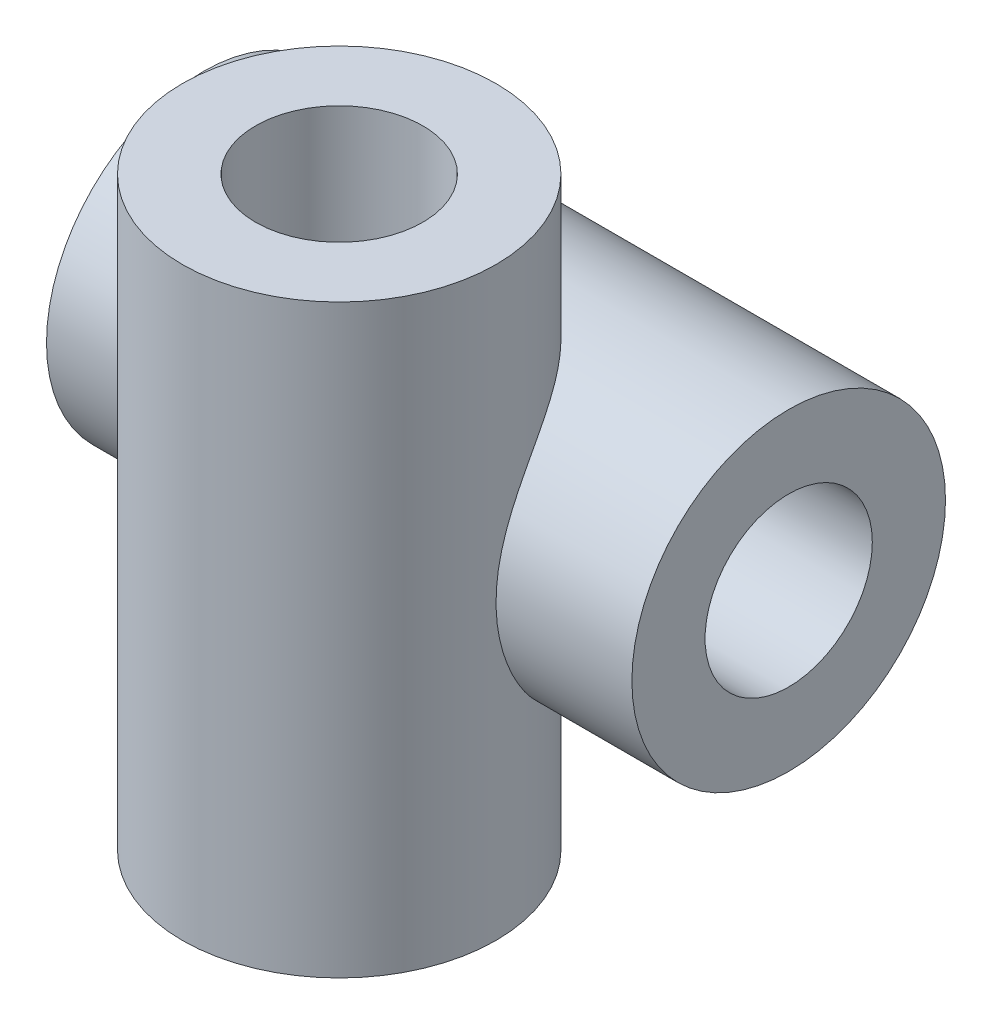
ISO-10303-21;
HEADER;
FILE_DESCRIPTION(('STEP AP214'),'2;1');
FILE_NAME('part.step','',(''),(''),'','','');
FILE_SCHEMA(('AUTOMOTIVE_DESIGN { 1 0 10303 214 1 1 1 1 }'));
ENDSEC;
DATA;
#1=APPLICATION_CONTEXT('core data for automotive mechanical design processes');
#2=APPLICATION_PROTOCOL_DEFINITION('international standard','automotive_design',2000,#1);
#3=PRODUCT_CONTEXT('',#1,'mechanical');
#4=PRODUCT('Part','Part','',(#3));
#5=PRODUCT_RELATED_PRODUCT_CATEGORY('part','',(#4));
#6=PRODUCT_DEFINITION_FORMATION('','',#4);
#7=PRODUCT_DEFINITION_CONTEXT('part definition',#1,'design');
#8=PRODUCT_DEFINITION('design','',#6,#7);
#9=PRODUCT_DEFINITION_SHAPE('','',#8);
#10=(LENGTH_UNIT() NAMED_UNIT(*) SI_UNIT(.MILLI.,.METRE.));
#11=(NAMED_UNIT(*) PLANE_ANGLE_UNIT() SI_UNIT($,.RADIAN.));
#12=(NAMED_UNIT(*) SI_UNIT($,.STERADIAN.) SOLID_ANGLE_UNIT());
#13=UNCERTAINTY_MEASURE_WITH_UNIT(LENGTH_MEASURE(1.E-05),#10,'distance_accuracy_value','');
#14=(GEOMETRIC_REPRESENTATION_CONTEXT(3) GLOBAL_UNCERTAINTY_ASSIGNED_CONTEXT((#13)) GLOBAL_UNIT_ASSIGNED_CONTEXT((#10,
#11,#12)) REPRESENTATION_CONTEXT('',''));
#15=CARTESIAN_POINT('',(0.,0.,0.));
#16=DIRECTION('',(0.,0.,1.));
#17=DIRECTION('',(1.,0.,0.));
#18=AXIS2_PLACEMENT_3D('',#15,#16,#17);
#19=CARTESIAN_POINT('',(0.,28.,0.));
#20=DIRECTION('',(0.,-1.,0.));
#21=DIRECTION('',(0.,0.,-1.));
#22=AXIS2_PLACEMENT_3D('',#19,#20,#21);
#23=CYLINDRICAL_SURFACE('',#22,15.);
#24=CARTESIAN_POINT('',(0.,-28.,0.));
#25=DIRECTION('',(0.,1.,0.));
#26=DIRECTION('',(0.,0.,1.));
#27=AXIS2_PLACEMENT_3D('',#24,#25,#26);
#28=CIRCLE('',#27,15.);
#29=CARTESIAN_POINT('',(0.,-28.,15.));
#30=VERTEX_POINT('',#29);
#31=EDGE_CURVE('E48',#30,#30,#28,.T.);
#32=ORIENTED_EDGE('',*,*,#31,.T.);
#33=EDGE_LOOP('',(#32));
#34=FACE_BOUND('',#33,.T.);
#35=CARTESIAN_POINT('',(0.,28.,0.));
#36=DIRECTION('',(0.,1.,0.));
#37=DIRECTION('',(0.,0.,1.));
#38=AXIS2_PLACEMENT_3D('',#35,#36,#37);
#39=CIRCLE('',#38,15.);
#40=CARTESIAN_POINT('',(0.,28.,15.));
#41=VERTEX_POINT('',#40);
#42=EDGE_CURVE('E43',#41,#41,#39,.T.);
#43=ORIENTED_EDGE('',*,*,#42,.F.);
#44=EDGE_LOOP('',(#43));
#45=FACE_BOUND('',#44,.T.);
#46=CARTESIAN_POINT('',(0.,15.,-15.));
#47=CARTESIAN_POINT('',(0.417709971837821,15.0000025275847,-14.999998325751));
#48=CARTESIAN_POINT('',(0.835456398856134,15.000031163326,-14.9825394653861));
#49=CARTESIAN_POINT('',(1.66806847536857,14.9997863331421,-14.912817418484));
#50=CARTESIAN_POINT('',(2.08293375279841,14.9995128289033,-14.8605498182809));
#51=CARTESIAN_POINT('',(2.9071670976013,14.9975759450424,-14.7215206566269));
#52=CARTESIAN_POINT('',(3.31653081524678,14.995911524653,-14.6347332908982));
#53=CARTESIAN_POINT('',(4.12654826909647,14.9894212157906,-14.4272792640556));
#54=CARTESIAN_POINT('',(4.52720223666966,14.9845954114039,-14.3066135040875));
#55=CARTESIAN_POINT('',(5.31746433504863,14.9693712510489,-14.0320974821879));
#56=CARTESIAN_POINT('',(5.70705741719865,14.9589656534166,-13.8782042517988));
#57=CARTESIAN_POINT('',(6.47177346518002,14.9296044255093,-13.5385074098473));
#58=CARTESIAN_POINT('',(6.84689610555341,14.9106486030507,-13.3527030810771));
#59=CARTESIAN_POINT('',(7.57964083484212,14.8607473501906,-12.9508144009089));
#60=CARTESIAN_POINT('',(7.93726695994425,14.8298046998012,-12.7347370779037));
#61=CARTESIAN_POINT('',(8.63209970901041,14.752134348305,-12.2743830224947));
#62=CARTESIAN_POINT('',(8.96930763389434,14.7054076541094,-12.0301080895543));
#63=CARTESIAN_POINT('',(9.60754858917371,14.5944084508421,-11.526221769803));
#64=CARTESIAN_POINT('',(9.90948071971079,14.53089382746,-11.2675841512964));
#65=CARTESIAN_POINT('',(10.4890939827049,14.3821301649425,-10.7301009567378));
#66=CARTESIAN_POINT('',(10.7667756748621,14.296881627604,-10.4512558473468));
#67=CARTESIAN_POINT('',(11.2951331244478,14.1015977919966,-9.87784104446114));
#68=CARTESIAN_POINT('',(11.5458455005311,13.9915967466957,-9.58329350605121));
#69=CARTESIAN_POINT('',(12.0187585400411,13.7441509370842,-8.98305875935943));
#70=CARTESIAN_POINT('',(12.2409641591352,13.6067109534576,-8.67737349917589));
#71=CARTESIAN_POINT('',(12.6274524871771,13.32339514769,-8.10250681122105));
#72=CARTESIAN_POINT('',(12.7955022804778,13.1812179294094,-7.83402422940655));
#73=CARTESIAN_POINT('',(13.1093115476913,12.8746146557727,-7.2967596411248));
#74=CARTESIAN_POINT('',(13.2550732812539,12.7101908590508,-7.02797766779786));
#75=CARTESIAN_POINT('',(13.5247243837763,12.3591733436415,-6.49394664135596));
#76=CARTESIAN_POINT('',(13.6486130091144,12.1725788715766,-6.22869770863737));
#77=CARTESIAN_POINT('',(13.8755078804518,11.7778553050838,-5.7054034000242));
#78=CARTESIAN_POINT('',(13.9785140050657,11.5697260854898,-5.44735806601005));
#79=CARTESIAN_POINT('',(14.1597157231284,11.145722501777,-4.95650028253699));
#80=CARTESIAN_POINT('',(14.2390049253452,10.9310002596004,-4.72309279834237));
#81=CARTESIAN_POINT('',(14.38195483643,10.4846003768036,-4.26805075057421));
#82=CARTESIAN_POINT('',(14.4456163765809,10.2529236388959,-4.04641556128824));
#83=CARTESIAN_POINT('',(14.5590981018285,9.77388127150179,-3.61690865445537));
#84=CARTESIAN_POINT('',(14.6089152039786,9.52651216260151,-3.40904001034665));
#85=CARTESIAN_POINT('',(14.6965685730541,9.01753128087283,-3.00879612011618));
#86=CARTESIAN_POINT('',(14.7344040189845,8.75591853349502,-2.81642193636331));
#87=CARTESIAN_POINT('',(14.8032316846784,8.19335340251167,-2.43033154847234));
#88=CARTESIAN_POINT('',(14.8331760304423,7.89107008738816,-2.23836683990684));
#89=CARTESIAN_POINT('',(14.883315572908,7.27294273934861,-1.87625669009447));
#90=CARTESIAN_POINT('',(14.9035102855258,6.95709803393673,-1.70611233256895));
#91=CARTESIAN_POINT('',(14.9364316770878,6.31357938932393,-1.38870004960014));
#92=CARTESIAN_POINT('',(14.9491551116875,5.98590037663112,-1.24144208277414));
#93=CARTESIAN_POINT('',(14.9691691593594,5.32067839439317,-0.970767855815314));
#94=CARTESIAN_POINT('',(14.976459496579,4.98313492490781,-0.847352806485482));
#95=CARTESIAN_POINT('',(14.9880693561707,4.25724558313709,-0.611144411772942));
#96=CARTESIAN_POINT('',(14.99190311799,3.86782701361573,-0.501611442069811));
#97=CARTESIAN_POINT('',(14.9969984270507,3.08138685892911,-0.314344517435135));
#98=CARTESIAN_POINT('',(14.9982597849855,2.6843647163767,-0.236612903144592));
#99=CARTESIAN_POINT('',(14.9996976549095,1.88528380098696,-0.113457713665762));
#100=CARTESIAN_POINT('',(14.9998740288551,1.48322439377409,-0.0680382502342384));
#101=CARTESIAN_POINT('',(15.0000249359791,0.676754199452415,-0.00982124349725945));
#102=CARTESIAN_POINT('',(14.9999994683809,0.27234340330326,0.00297617430338129));
#103=CARTESIAN_POINT('',(15.0000005307192,-0.552942244332754,-0.00428381568195574));
#104=CARTESIAN_POINT('',(15.0000292568406,-0.973805615224164,-0.0257232450051484));
#105=CARTESIAN_POINT('',(14.9996905962732,-1.81224941833119,-0.103925278140252));
#106=CARTESIAN_POINT('',(14.9993231943443,-2.22982972361712,-0.160689240932772));
#107=CARTESIAN_POINT('',(14.9969971798298,-3.05888979921935,-0.309166061988291));
#108=CARTESIAN_POINT('',(14.9950379735013,-3.47036723484069,-0.400891954268476));
#109=CARTESIAN_POINT('',(14.9876331754656,-4.28411894959553,-0.618632825069207));
#110=CARTESIAN_POINT('',(14.982187601157,-4.68639327464662,-0.74464763246966));
#111=CARTESIAN_POINT('',(14.9652665429499,-5.47919975751459,-1.03017356463985));
#112=CARTESIAN_POINT('',(14.9537851937244,-5.86972010232427,-1.18971718069707));
#113=CARTESIAN_POINT('',(14.9216787965115,-6.63566143072044,-1.54096979692591));
#114=CARTESIAN_POINT('',(14.9010535709823,-7.01108212097061,-1.7326794216028));
#115=CARTESIAN_POINT('',(14.8470853067959,-7.74371646630495,-2.14652582197755));
#116=CARTESIAN_POINT('',(14.8137454145061,-8.10093460101616,-2.36865506133861));
#117=CARTESIAN_POINT('',(14.7304290712197,-8.79417525322152,-2.84111978796304));
#118=CARTESIAN_POINT('',(14.6804539153127,-9.13019941828836,-3.09145307847951));
#119=CARTESIAN_POINT('',(14.5628071250424,-9.76181446763479,-3.60420732929144));
#120=CARTESIAN_POINT('',(14.4961423064136,-10.0585860628554,-3.86540288898498));
#121=CARTESIAN_POINT('',(14.3407053418227,-10.6276628835971,-4.40721566435319));
#122=CARTESIAN_POINT('',(14.2519339136703,-10.8999689031335,-4.68783224920658));
#123=CARTESIAN_POINT('',(14.0493520370309,-11.417455725919,-5.26391201064581));
#124=CARTESIAN_POINT('',(13.9355763438465,-11.6626734771806,-5.55935414451208));
#125=CARTESIAN_POINT('',(13.680475150859,-12.124597680121,-6.16044533907027));
#126=CARTESIAN_POINT('',(13.5391543095529,-12.3413089425155,-6.46609266660368));
#127=CARTESIAN_POINT('',(13.2488758966405,-12.7174277513136,-7.03959780075856));
#128=CARTESIAN_POINT('',(13.1036417555113,-12.8806172855798,-7.30687149643044));
#129=CARTESIAN_POINT('',(12.7911537375353,-13.1849884825537,-7.84105134416567));
#130=CARTESIAN_POINT('',(12.6239021354562,-13.3261724155173,-8.10795753132409));
#131=CARTESIAN_POINT('',(12.267544746936,-13.5870488047741,-8.63766494449648));
#132=CARTESIAN_POINT('',(12.078437271943,-13.7067395987131,-8.9004658515598));
#133=CARTESIAN_POINT('',(11.6790781220965,-13.9256844769775,-9.41838952491073));
#134=CARTESIAN_POINT('',(11.4688262004683,-14.024938322744,-9.67351220154133));
#135=CARTESIAN_POINT('',(11.0396243426252,-14.1999371914326,-10.1600437712008));
#136=CARTESIAN_POINT('',(10.8216742203904,-14.276627138358,-10.3919977540913));
#137=CARTESIAN_POINT('',(10.3689813370875,-14.414617611834,-10.8437296185302));
#138=CARTESIAN_POINT('',(10.1342393897364,-14.475918883458,-11.0635080891787));
#139=CARTESIAN_POINT('',(9.64925307394955,-14.5849506723218,-11.4889513321215));
#140=CARTESIAN_POINT('',(9.3990052306523,-14.6326781341862,-11.694612918907));
#141=CARTESIAN_POINT('',(8.88446890299318,-14.7164399177867,-12.0901421483108));
#142=CARTESIAN_POINT('',(8.62017945605568,-14.7524734366765,-12.2800087058581));
#143=CARTESIAN_POINT('',(8.05102826782537,-14.8179616742382,-12.6613618089926));
#144=CARTESIAN_POINT('',(7.74479636819553,-14.8463515380935,-12.8509876291343));
#145=CARTESIAN_POINT('',(7.11892934690682,-14.8936592770593,-13.2079773900183));
#146=CARTESIAN_POINT('',(6.7992935241429,-14.912576656031,-13.3753401643555));
#147=CARTESIAN_POINT('',(6.14837455164384,-14.9432236604979,-13.6867715681367));
#148=CARTESIAN_POINT('',(5.81708641824675,-14.9549501699605,-13.8308300792237));
#149=CARTESIAN_POINT('',(5.14485615907067,-14.9732408542989,-14.094710469419));
#150=CARTESIAN_POINT('',(4.8039135592245,-14.979804775217,-14.2145311560068));
#151=CARTESIAN_POINT('',(4.07183297818376,-14.990121961217,-14.4424590150756));
#152=CARTESIAN_POINT('',(3.67967383188683,-14.9934309013979,-14.54731909127));
#153=CARTESIAN_POINT('',(2.88812178634528,-14.997740566843,-14.7249213546017));
#154=CARTESIAN_POINT('',(2.48872836211208,-14.998741123907,-14.7976612009872));
#155=CARTESIAN_POINT('',(1.685308229022,-14.9998397663108,-14.9105433650262));
#156=CARTESIAN_POINT('',(1.28128097591122,-14.999937744531,-14.9506818129724));
#157=CARTESIAN_POINT('',(0.471306250593105,-15.000018502555,-14.9980817343519));
#158=CARTESIAN_POINT('',(0.06535877368235,-15.0000012820766,-15.0053431272139));
#159=CARTESIAN_POINT('',(-0.76126669644604,-14.9999976573918,-14.9865882940012));
#160=CARTESIAN_POINT('',(-1.18191624499946,-15.0000124530755,-14.9592928154225));
#161=CARTESIAN_POINT('',(-2.01943867877046,-14.9994984798848,-14.8694068989933));
#162=CARTESIAN_POINT('',(-2.43631142428532,-14.9989696909855,-14.8068151609178));
#163=CARTESIAN_POINT('',(-3.26347110832669,-14.9960533722076,-14.646749633596));
#164=CARTESIAN_POINT('',(-3.67375541787015,-14.993665118277,-14.5492622644269));
#165=CARTESIAN_POINT('',(-4.4846293851358,-14.9850220601042,-14.3201117746154));
#166=CARTESIAN_POINT('',(-4.88521909368037,-14.9787672761363,-14.1884488331755));
#167=CARTESIAN_POINT('',(-5.67392362890758,-14.9597503529937,-13.8918735471291));
#168=CARTESIAN_POINT('',(-6.06203370898498,-14.9469857682351,-13.7269487208767));
#169=CARTESIAN_POINT('',(-6.82266970930115,-14.9117548235055,-13.3651980715453));
#170=CARTESIAN_POINT('',(-7.19519532825068,-14.8892882760648,-13.1683716320813));
#171=CARTESIAN_POINT('',(-7.92151852307116,-14.8310187684496,-12.7446552542559));
#172=CARTESIAN_POINT('',(-8.27532216941276,-14.7952201617418,-12.5177751452209));
#173=CARTESIAN_POINT('',(-8.96123733623553,-14.7063314905135,-12.0362676261595));
#174=CARTESIAN_POINT('',(-9.29335069808289,-14.6532428960989,-11.7816425764107));
#175=CARTESIAN_POINT('',(-9.91548657821462,-14.5291631531157,-11.2622520360475));
#176=CARTESIAN_POINT('',(-10.2068146694757,-14.4592978076699,-10.9987834035281));
#177=CARTESIAN_POINT('',(-10.764835826514,-14.2971331635782,-10.4532532242111));
#178=CARTESIAN_POINT('',(-11.0315297960786,-14.2048346884203,-10.1711923601845));
#179=CARTESIAN_POINT('',(-11.53773982334,-13.9950006354704,-9.59312065889746));
#180=CARTESIAN_POINT('',(-11.7772919798532,-13.8774991945389,-9.29712910960479));
#181=CARTESIAN_POINT('',(-12.2279460980616,-13.6149048832945,-8.69588466944503));
#182=CARTESIAN_POINT('',(-12.4390527119342,-13.4698165341135,-8.39063330302027));
#183=CARTESIAN_POINT('',(-12.8048141383633,-13.1727416719668,-7.81892216972819));
#184=CARTESIAN_POINT('',(-12.963238738573,-13.0244764549391,-7.55292846006171));
#185=CARTESIAN_POINT('',(-13.2583693053292,-12.7061633741991,-7.02195650004423));
#186=CARTESIAN_POINT('',(-13.395077533706,-12.53611778232,-6.75697814674968));
#187=CARTESIAN_POINT('',(-13.647384342418,-12.1744926574608,-6.23168058642494));
#188=CARTESIAN_POINT('',(-13.7629805973752,-11.9829107561142,-5.97136189547806));
#189=CARTESIAN_POINT('',(-13.9741803664326,-11.5789912462284,-5.45885689865767));
#190=CARTESIAN_POINT('',(-14.0697835384791,-11.366653282673,-5.20667073198275));
#191=CARTESIAN_POINT('',(-14.2387402637397,-10.9322528291606,-4.72447279379023));
#192=CARTESIAN_POINT('',(-14.3128925852103,-10.7110393607413,-4.49397361908411));
#193=CARTESIAN_POINT('',(-14.4460447978536,-10.2519779947188,-4.04555333499994));
#194=CARTESIAN_POINT('',(-14.5050453482254,-10.0141308213613,-3.82763167873924));
#195=CARTESIAN_POINT('',(-14.6097433955921,-9.52311458713808,-3.40625223049219));
#196=CARTESIAN_POINT('',(-14.6554378288615,-9.2699420137909,-3.20279777770832));
#197=CARTESIAN_POINT('',(-14.7354174888615,-8.74975282234133,-2.81198598361791));
#198=CARTESIAN_POINT('',(-14.7697019320976,-8.48273525499358,-2.62462974838928));
#199=CARTESIAN_POINT('',(-14.8319351648085,-7.90693691988514,-2.24809675755569));
#200=CARTESIAN_POINT('',(-14.8588071811872,-7.5967517488417,-2.06088800259792));
#201=CARTESIAN_POINT('',(-14.9033603454453,-6.96314070546059,-1.70917620406524));
#202=CARTESIAN_POINT('',(-14.9210409882503,-6.63971410654734,-1.54467440862369));
#203=CARTESIAN_POINT('',(-14.9494965763765,-5.98140178046816,-1.2393847884451));
#204=CARTESIAN_POINT('',(-14.9602685491387,-5.64651118593719,-1.09860719058021));
#205=CARTESIAN_POINT('',(-14.9769200974444,-4.96729250555149,-0.841685555053715));
#206=CARTESIAN_POINT('',(-14.9827994404127,-4.62296397186009,-0.725542688619921));
#207=CARTESIAN_POINT('',(-14.9919111192904,-3.88481564649686,-0.506078994838479));
#208=CARTESIAN_POINT('',(-14.9947396279387,-3.49002772404388,-0.405984559761038));
#209=CARTESIAN_POINT('',(-14.9983429355167,-2.69359749884994,-0.238219094262302));
#210=CARTESIAN_POINT('',(-14.9991175865037,-2.29195470443869,-0.170550399806542));
#211=CARTESIAN_POINT('',(-14.999933279163,-1.48444774163236,-0.0680856434553241));
#212=CARTESIAN_POINT('',(-14.9999742387192,-1.07858310580705,-0.0332932615528909));
#213=CARTESIAN_POINT('',(-15.0000106423255,-0.265372678028724,0.00317452343168053));
#214=CARTESIAN_POINT('',(-15.0000060863221,0.141973115665028,0.0048498875803842));
#215=CARTESIAN_POINT('',(-14.9999868633883,0.969694980233527,-0.0254503617372257));
#216=CARTESIAN_POINT('',(-14.9999718483227,1.39002837480144,-0.0586052388162819));
#217=CARTESIAN_POINT('',(-14.9992304210627,2.22642477339109,-0.160171370806028));
#218=CARTESIAN_POINT('',(-14.9985039837933,2.64248762636941,-0.228583868379678));
#219=CARTESIAN_POINT('',(-14.994905520696,3.46754211889929,-0.400213627508895));
#220=CARTESIAN_POINT('',(-14.9920326268273,3.87653082913923,-0.503444960757911));
#221=CARTESIAN_POINT('',(-14.9820225517436,4.68432250403006,-0.743958805023065));
#222=CARTESIAN_POINT('',(-14.9748853944318,5.0831255257637,-0.881241125164065));
#223=CARTESIAN_POINT('',(-14.9536126384601,5.86751479982603,-1.18878435862917));
#224=CARTESIAN_POINT('',(-14.9394787957718,6.25310434241862,-1.35903699080654));
#225=CARTESIAN_POINT('',(-14.9009412562617,7.00821614668934,-1.73116221311833));
#226=CARTESIAN_POINT('',(-14.8765373625117,7.37773810012169,-1.93303540953014));
#227=CARTESIAN_POINT('',(-14.8137698026862,8.09753449706135,-2.36645996334791));
#228=CARTESIAN_POINT('',(-14.7754118449636,8.44781674383586,-2.59799915987989));
#229=CARTESIAN_POINT('',(-14.6807510116949,9.12619725945571,-3.08834147291993));
#230=CARTESIAN_POINT('',(-14.6244497948878,9.45429757548092,-3.34714206780705));
#231=CARTESIAN_POINT('',(-14.4937919223737,10.0667624654539,-3.87284899376697));
#232=CARTESIAN_POINT('',(-14.4206869208243,10.3525633281887,-4.13839119791312));
#233=CARTESIAN_POINT('',(-14.2517478013455,10.8993880329059,-4.68722419827999));
#234=CARTESIAN_POINT('',(-14.1559146133894,11.160412888041,-4.97051426795923));
#235=CARTESIAN_POINT('',(-13.9388491803313,11.6552668258466,-5.55014386856029));
#236=CARTESIAN_POINT('',(-13.8176500834202,11.8891307882449,-5.84646597391305));
#237=CARTESIAN_POINT('',(-13.5476586898121,12.3285048685973,-6.44742990287859));
#238=CARTESIAN_POINT('',(-13.3988707512367,12.5340194558824,-6.75207040598813));
#239=CARTESIAN_POINT('',(-13.0951017540281,12.8895611362829,-7.32172455560823));
#240=CARTESIAN_POINT('',(-12.9438251014627,13.0433312358569,-7.58638984087106));
#241=CARTESIAN_POINT('',(-12.619730308724,13.3294450567416,-8.11407622866195));
#242=CARTESIAN_POINT('',(-12.4469144297067,13.4617910237784,-8.37709750073688));
#243=CARTESIAN_POINT('',(-12.0800726182401,13.7057506182039,-8.89793958615125));
#244=CARTESIAN_POINT('',(-11.8860442187562,13.8173618300393,-9.15575979046291));
#245=CARTESIAN_POINT('',(-11.4776154395226,14.0210310230498,-9.66283227625403));
#246=CARTESIAN_POINT('',(-11.2632146149477,14.1130885771349,-9.91208437048967));
#247=CARTESIAN_POINT('',(-10.82361019443,14.2761597284386,-10.3899431214731));
#248=CARTESIAN_POINT('',(-10.5991084866862,14.3478305308261,-10.6189731207762));
#249=CARTESIAN_POINT('',(-10.1336258102336,14.4762563838955,-11.0640554631881));
#250=CARTESIAN_POINT('',(-9.89264545461971,14.5330119891232,-11.2801082885568));
#251=CARTESIAN_POINT('',(-9.39551484631454,14.6334912507153,-11.6974214355873));
#252=CARTESIAN_POINT('',(-9.13935953125587,14.6772105284794,-11.8986767700534));
#253=CARTESIAN_POINT('',(-8.61339639941469,14.7535190414902,-12.2847815613977));
#254=CARTESIAN_POINT('',(-8.34358772020557,14.7861075726435,-12.4696299798828));
#255=CARTESIAN_POINT('',(-7.7610097757433,14.84517720896,-12.8413017853707));
#256=CARTESIAN_POINT('',(-7.44680423572304,14.8705725748909,-13.0260484366996));
#257=CARTESIAN_POINT('',(-6.80530721959462,14.912454849238,-13.3723855901529));
#258=CARTESIAN_POINT('',(-6.47801469852342,14.9289410447474,-13.5339742384267));
#259=CARTESIAN_POINT('',(-5.81229875123834,14.955283533636,-13.8329436608701));
#260=CARTESIAN_POINT('',(-5.47387507983621,14.9651396808709,-13.9703239013715));
#261=CARTESIAN_POINT('',(-4.78783544663084,14.980231595058,-14.2200520640382));
#262=CARTESIAN_POINT('',(-4.44021988943756,14.9854675650343,-14.3324010859867));
#263=CARTESIAN_POINT('',(-3.75693364038494,14.9928041154155,-14.5259958208984));
#264=CARTESIAN_POINT('',(-3.42165055746727,14.9950606231192,-14.608607372288));
#265=CARTESIAN_POINT('',(-2.74619588077473,14.9980930493288,-14.7505082532686));
#266=CARTESIAN_POINT('',(-2.40602455360133,14.998869048274,-14.809798849802));
#267=CARTESIAN_POINT('',(-1.72238277382855,14.9997731771385,-14.9047809543717));
#268=CARTESIAN_POINT('',(-1.37891215764361,14.9999012747655,-14.9404712860667));
#269=CARTESIAN_POINT('',(-0.690302776962591,15.0000136497434,-14.9880827979489));
#270=CARTESIAN_POINT('',(-0.34516383449116,14.9999979113957,-15.0000013834724));
#271=CARTESIAN_POINT('',(0.,15.,-15.));
#272=B_SPLINE_CURVE_WITH_KNOTS('',3,(#46,#47,#48,#49,#50,#51,#52,#53,#54,#55,#56,#57,#58,#59,
#60,#61,#62,#63,#64,#65,#66,#67,#68,#69,#70,#71,#72,#73,#74,#75,#76,#77,#78,#79,#80,#81,#82,#83,
#84,#85,#86,#87,#88,#89,#90,#91,#92,#93,#94,#95,#96,#97,#98,#99,#100,#101,#102,#103,#104,#105,
#106,#107,#108,#109,#110,#111,#112,#113,#114,#115,#116,#117,#118,#119,#120,#121,#122,#123,#124,
#125,#126,#127,#128,#129,#130,#131,#132,#133,#134,#135,#136,#137,#138,#139,#140,#141,#142,#143,
#144,#145,#146,#147,#148,#149,#150,#151,#152,#153,#154,#155,#156,#157,#158,#159,#160,#161,#162,
#163,#164,#165,#166,#167,#168,#169,#170,#171,#172,#173,#174,#175,#176,#177,#178,#179,#180,#181,
#182,#183,#184,#185,#186,#187,#188,#189,#190,#191,#192,#193,#194,#195,#196,#197,#198,#199,#200,
#201,#202,#203,#204,#205,#206,#207,#208,#209,#210,#211,#212,#213,#214,#215,#216,#217,#218,#219,
#220,#221,#222,#223,#224,#225,#226,#227,#228,#229,#230,#231,#232,#233,#234,#235,#236,#237,#238,
#239,#240,#241,#242,#243,#244,#245,#246,#247,#248,#249,#250,#251,#252,#253,#254,#255,#256,#257,
#258,#259,#260,#261,#262,#263,#264,#265,#266,#267,#268,#269,#270,#271),.UNSPECIFIED.,.T.,.F.,(4,
2,2,2,2,2,2,2,2,2,2,2,2,2,2,2,2,2,2,2,2,2,2,2,2,2,2,2,2,2,2,2,2,2,2,2,2,2,2,2,2,2,2,2,2,2,2,2,2,
2,2,2,2,2,2,2,2,2,2,2,2,2,2,2,2,2,2,2,2,2,2,2,2,2,2,2,2,2,2,2,2,2,2,2,2,2,2,2,2,2,2,2,2,2,2,2,2,
2,2,2,2,2,2,2,2,2,2,2,2,2,2,2,4),(0.,1.25282897373118,2.50581683347048,3.75974309457726,
5.01363600512369,6.2691602173617,7.52471265143269,8.77997406911698,10.035155425063,
11.2412350291641,12.4472867895808,13.6516797468839,14.8558630457471,15.896034729115,
16.9361008858276,17.9762023949406,19.0163099497604,19.9960013953546,20.9756407168899,
21.9554980147742,22.9354224389284,24.0123299429209,25.0892909115001,26.1667191968537,
27.2442021823373,28.4564822813762,29.66885159052,30.8813751474109,32.0939033691629,
33.3566265945016,34.6193984014435,35.882641438481,37.1458781713732,38.4103447429944,
39.6748358671629,40.9390142835913,42.2030943041297,43.4041344703159,44.605135643378,
45.8044778959029,47.0036174887093,48.037835860962,49.0719474650945,50.1061390166039,
51.1403426394585,52.1214817789059,53.1025734053855,54.08388569468,55.0652653416058,
56.1480743377598,57.2309400420926,58.3142746556142,59.3976625571156,60.6141378859608,
61.8307018504478,63.0474101970495,64.2641215254188,65.5272195680177,66.7903641430031,
68.054000816506,69.3176308641621,70.5817359789423,71.8458655209661,73.109582634035,
74.3731923257917,75.5683395036946,76.7634428160914,77.9569374959037,79.1502367459462,
80.178700952134,81.2070579701137,82.2355281882362,83.2640160006113,84.246887264415,
85.229715759781,86.212770372214,87.1958924745379,88.2846636712954,89.3734946907243,
90.4627938823141,91.5521448516831,92.7726267871676,93.9931966335285,95.2139030875646,
96.4346109767026,97.6980229309544,98.9614794174973,100.225447130718,101.489407758841,
102.753051329017,104.016719130649,105.279870569084,106.542905271142,107.731912343029,
108.920870772493,110.108285064509,111.295511944015,112.318494024694,113.34136880454,
114.364362672422,115.387378882181,116.372211735345,117.357007967314,118.342134597878,
119.327323532685,120.422332485795,121.517429047944,122.612549748198,123.70762232323,
124.742756827854,125.777835089623,126.812964940373,127.848207768386),.UNSPECIFIED.);
#273=CARTESIAN_POINT('',(0.,15.,-15.));
#274=VERTEX_POINT('',#273);
#275=EDGE_CURVE('E10',#274,#274,#272,.T.);
#276=ORIENTED_EDGE('',*,*,#275,.F.);
#277=EDGE_LOOP('',(#276));
#278=FACE_BOUND('',#277,.T.);
#279=ADVANCED_FACE('F31',(#34,#45,#278),#23,.T.);
#280=CARTESIAN_POINT('',(0.,28.,0.));
#281=DIRECTION('',(0.,1.,0.));
#282=DIRECTION('',(0.,0.,1.));
#283=AXIS2_PLACEMENT_3D('',#280,#281,#282);
#284=PLANE('',#283);
#285=ORIENTED_EDGE('',*,*,#42,.T.);
#286=EDGE_LOOP('',(#285));
#287=FACE_BOUND('',#286,.T.);
#288=CARTESIAN_POINT('',(0.,28.,0.));
#289=DIRECTION('',(0.,1.,0.));
#290=DIRECTION('',(0.,0.,1.));
#291=AXIS2_PLACEMENT_3D('',#288,#289,#290);
#292=CIRCLE('',#291,8.);
#293=CARTESIAN_POINT('',(0.,28.,8.));
#294=VERTEX_POINT('',#293);
#295=EDGE_CURVE('E57',#294,#294,#292,.T.);
#296=ORIENTED_EDGE('',*,*,#295,.F.);
#297=EDGE_LOOP('',(#296));
#298=FACE_BOUND('',#297,.T.);
#299=ADVANCED_FACE('F73',(#287,#298),#284,.T.);
#300=CARTESIAN_POINT('',(0.,-28.,0.));
#301=DIRECTION('',(0.,1.,0.));
#302=DIRECTION('',(0.,0.,1.));
#303=AXIS2_PLACEMENT_3D('',#300,#301,#302);
#304=PLANE('',#303);
#305=ORIENTED_EDGE('',*,*,#31,.F.);
#306=EDGE_LOOP('',(#305));
#307=FACE_BOUND('',#306,.T.);
#308=CARTESIAN_POINT('',(0.,-28.,0.));
#309=DIRECTION('',(0.,1.,0.));
#310=DIRECTION('',(0.,0.,1.));
#311=AXIS2_PLACEMENT_3D('',#308,#309,#310);
#312=CIRCLE('',#311,8.);
#313=CARTESIAN_POINT('',(0.,-28.,8.));
#314=VERTEX_POINT('',#313);
#315=EDGE_CURVE('E94',#314,#314,#312,.T.);
#316=ORIENTED_EDGE('',*,*,#315,.T.);
#317=EDGE_LOOP('',(#316));
#318=FACE_BOUND('',#317,.T.);
#319=ADVANCED_FACE('F64',(#307,#318),#304,.F.);
#320=CARTESIAN_POINT('',(28.,0.,-15.));
#321=DIRECTION('',(-1.,0.,0.));
#322=DIRECTION('',(0.,0.,1.));
#323=AXIS2_PLACEMENT_3D('',#320,#321,#322);
#324=CYLINDRICAL_SURFACE('',#323,15.);
#325=CARTESIAN_POINT('',(28.,0.,-15.));
#326=DIRECTION('',(1.,0.,0.));
#327=DIRECTION('',(0.,0.,-1.));
#328=AXIS2_PLACEMENT_3D('',#325,#326,#327);
#329=CIRCLE('',#328,15.);
#330=CARTESIAN_POINT('',(28.,0.,-30.));
#331=VERTEX_POINT('',#330);
#332=EDGE_CURVE('E96',#331,#331,#329,.T.);
#333=ORIENTED_EDGE('',*,*,#332,.F.);
#334=EDGE_LOOP('',(#333));
#335=FACE_BOUND('',#334,.T.);
#336=CARTESIAN_POINT('',(-28.,0.,-15.));
#337=DIRECTION('',(1.,0.,0.));
#338=DIRECTION('',(0.,0.,-1.));
#339=AXIS2_PLACEMENT_3D('',#336,#337,#338);
#340=CIRCLE('',#339,15.);
#341=CARTESIAN_POINT('',(-28.,0.,-30.));
#342=VERTEX_POINT('',#341);
#343=EDGE_CURVE('E55',#342,#342,#340,.T.);
#344=ORIENTED_EDGE('',*,*,#343,.T.);
#345=EDGE_LOOP('',(#344));
#346=FACE_BOUND('',#345,.T.);
#347=ORIENTED_EDGE('',*,*,#275,.T.);
#348=EDGE_LOOP('',(#347));
#349=FACE_BOUND('',#348,.T.);
#350=ADVANCED_FACE('F59',(#335,#346,#349),#324,.T.);
#351=CARTESIAN_POINT('',(28.,0.,-15.));
#352=DIRECTION('',(-1.,0.,0.));
#353=DIRECTION('',(0.,0.,1.));
#354=AXIS2_PLACEMENT_3D('',#351,#352,#353);
#355=CYLINDRICAL_SURFACE('',#354,8.);
#356=CARTESIAN_POINT('',(-28.,0.,-15.));
#357=DIRECTION('',(1.,0.,0.));
#358=DIRECTION('',(0.,0.,-1.));
#359=AXIS2_PLACEMENT_3D('',#356,#357,#358);
#360=CIRCLE('',#359,8.);
#361=CARTESIAN_POINT('',(-28.,0.,-23.));
#362=VERTEX_POINT('',#361);
#363=EDGE_CURVE('E104',#362,#362,#360,.T.);
#364=ORIENTED_EDGE('',*,*,#363,.F.);
#365=EDGE_LOOP('',(#364));
#366=FACE_BOUND('',#365,.T.);
#367=CARTESIAN_POINT('',(28.,0.,-15.));
#368=DIRECTION('',(1.,0.,0.));
#369=DIRECTION('',(0.,0.,-1.));
#370=AXIS2_PLACEMENT_3D('',#367,#368,#369);
#371=CIRCLE('',#370,8.);
#372=CARTESIAN_POINT('',(28.,0.,-23.));
#373=VERTEX_POINT('',#372);
#374=EDGE_CURVE('E102',#373,#373,#371,.T.);
#375=ORIENTED_EDGE('',*,*,#374,.T.);
#376=EDGE_LOOP('',(#375));
#377=FACE_BOUND('',#376,.T.);
#378=CARTESIAN_POINT('',(0.,3.87298334620742,-8.));
#379=CARTESIAN_POINT('',(-0.214883627526405,3.8729803370869,-7.99998913841976));
#380=CARTESIAN_POINT('',(-0.429965434277398,3.85732336023061,-7.99126424962142));
#381=CARTESIAN_POINT('',(-0.854381318521276,3.79458153246159,-7.957104123558));
#382=CARTESIAN_POINT('',(-1.06370621626459,3.747449210782,-7.93164364677686));
#383=CARTESIAN_POINT('',(-1.47046559022041,3.62169233343564,-7.86639335909591));
#384=CARTESIAN_POINT('',(-1.66789563677609,3.54305612806169,-7.82659824799332));
#385=CARTESIAN_POINT('',(-2.04476466718924,3.35488203056297,-7.73669682222451));
#386=CARTESIAN_POINT('',(-2.22421348135754,3.24536114934705,-7.68659618781556));
#387=CARTESIAN_POINT('',(-2.5570748756092,2.99921109877868,-7.58230320573637));
#388=CARTESIAN_POINT('',(-2.7108794972594,2.86307641289253,-7.52819527062949));
#389=CARTESIAN_POINT('',(-2.99215345452926,2.56557280533346,-7.42089885412424));
#390=CARTESIAN_POINT('',(-3.11962280350285,2.40420389645624,-7.36771037225965));
#391=CARTESIAN_POINT('',(-3.34401441987149,2.06310552718768,-7.26859364373394));
#392=CARTESIAN_POINT('',(-3.44135504197642,1.88367813154218,-7.22257083345009));
#393=CARTESIAN_POINT('',(-3.606828421208,1.50954970122749,-7.141380916677));
#394=CARTESIAN_POINT('',(-3.67495715004365,1.31484656442536,-7.10621530757206));
#395=CARTESIAN_POINT('',(-3.7825601878654,0.912248683423441,-7.04954101928621));
#396=CARTESIAN_POINT('',(-3.82153915234173,0.704188413624399,-7.02826917056968));
#397=CARTESIAN_POINT('',(-3.86900767130598,0.283590086601014,-7.00225076148422));
#398=CARTESIAN_POINT('',(-3.87749203312493,0.0710512729603968,-6.99750701555087));
#399=CARTESIAN_POINT('',(-3.86383449755611,-0.357650386802515,-7.00505932297195));
#400=CARTESIAN_POINT('',(-3.84098436762392,-0.573784283397867,-7.0177494341166));
#401=CARTESIAN_POINT('',(-3.76332095820755,-0.998582062949028,-7.05969850683905));
#402=CARTESIAN_POINT('',(-3.70850891154269,-1.20724623369396,-7.0889568293547));
#403=CARTESIAN_POINT('',(-3.56718108268814,-1.61047070489141,-7.1611075681008));
#404=CARTESIAN_POINT('',(-3.48074527271091,-1.80506511207694,-7.20396555665678));
#405=CARTESIAN_POINT('',(-3.27694127340906,-2.17481250772299,-7.2989194176461));
#406=CARTESIAN_POINT('',(-3.15958072932926,-2.34997028613817,-7.35101300580493));
#407=CARTESIAN_POINT('',(-2.89925501264309,-2.67169932186801,-7.45744826834713));
#408=CARTESIAN_POINT('',(-2.75699536067199,-2.81887074686268,-7.51170240501461));
#409=CARTESIAN_POINT('',(-2.44835118329717,-3.086278055912,-7.61788342414733));
#410=CARTESIAN_POINT('',(-2.28196758968123,-3.20651497985607,-7.66981039639797));
#411=CARTESIAN_POINT('',(-1.93161701735107,-3.4166937773999,-7.76539966000005));
#412=CARTESIAN_POINT('',(-1.74786562957125,-3.50695700160736,-7.80914726305343));
#413=CARTESIAN_POINT('',(-1.36638114521414,-3.65811173357365,-7.88484735351134));
#414=CARTESIAN_POINT('',(-1.16864581053288,-3.71899852743745,-7.91679794771343));
#415=CARTESIAN_POINT('',(-0.7607070412214,-3.81209407282129,-7.96645149193628));
#416=CARTESIAN_POINT('',(-0.550335800692504,-3.84372131879036,-7.98386489700822));
#417=CARTESIAN_POINT('',(-0.126504849466545,-3.87630240395929,-8.00181265321575));
#418=CARTESIAN_POINT('',(0.0869553457198989,-3.87725137807223,-8.00234432717652));
#419=CARTESIAN_POINT('',(0.515661103184988,-3.84816267834098,-7.98630391536616));
#420=CARTESIAN_POINT('',(0.73084936114054,-3.81747101743475,-7.96937084359755));
#421=CARTESIAN_POINT('',(1.15221613293322,-3.72402236466647,-7.91943226881751));
#422=CARTESIAN_POINT('',(1.35839534313272,-3.66126785590713,-7.88642801044614));
#423=CARTESIAN_POINT('',(1.7543678755228,-3.50438864373229,-7.80786096940996));
#424=CARTESIAN_POINT('',(1.94425621770615,-3.41046399831376,-7.76237858918272));
#425=CARTESIAN_POINT('',(2.30334513830637,-3.19219676663304,-7.66350494160731));
#426=CARTESIAN_POINT('',(2.47255070930045,-3.06786154295894,-7.61011558981797));
#427=CARTESIAN_POINT('',(2.78150668016229,-2.79468839597981,-7.5026238935339));
#428=CARTESIAN_POINT('',(2.92189312792187,-2.64654870813129,-7.44857362115017));
#429=CARTESIAN_POINT('',(3.17523013664384,-2.32730015901554,-7.34416405300258));
#430=CARTESIAN_POINT('',(3.28818078486221,-2.15619137080123,-7.29380474550044));
#431=CARTESIAN_POINT('',(3.48409553231723,-1.79708580221908,-7.2022731140653));
#432=CARTESIAN_POINT('',(3.56727032944396,-1.60921992941067,-7.16103706051537));
#433=CARTESIAN_POINT('',(3.70409516930105,-1.22080624268936,-7.09123447259536));
#434=CARTESIAN_POINT('',(3.75774019979047,-1.02025628227694,-7.06267008921339));
#435=CARTESIAN_POINT('',(3.83624984703086,-0.607507337708639,-7.02034511438139));
#436=CARTESIAN_POINT('',(3.86046146594707,-0.39514970574698,-7.00692086723296));
#437=CARTESIAN_POINT('',(3.87801987794433,0.0312433146318462,-6.99721803862708));
#438=CARTESIAN_POINT('',(3.87136226312677,0.245278938297441,-7.0009419057932));
#439=CARTESIAN_POINT('',(3.82672963911173,0.67316048479722,-7.02543971565727));
#440=CARTESIAN_POINT('',(3.78817078935278,0.886927873358068,-7.04653148289625));
#441=CARTESIAN_POINT('',(3.67893013220593,1.30391536658629,-7.10417181668188));
#442=CARTESIAN_POINT('',(3.6082517299805,1.50713658676441,-7.14071874471724));
#443=CARTESIAN_POINT('',(3.43598608346506,1.89499817931632,-7.22516847306509));
#444=CARTESIAN_POINT('',(3.33471258523486,2.07980295428594,-7.27295496118892));
#445=CARTESIAN_POINT('',(3.10236592640311,2.42754857929698,-7.37504900796855));
#446=CARTESIAN_POINT('',(2.97130151238168,2.59049582440086,-7.42935465040401));
#447=CARTESIAN_POINT('',(2.68580088700841,2.88627178412337,-7.53718171183256));
#448=CARTESIAN_POINT('',(2.53203861804063,3.01975727974386,-7.59068829337349));
#449=CARTESIAN_POINT('',(2.20268406873035,3.25891828106849,-7.69271450315002));
#450=CARTESIAN_POINT('',(2.02708383326346,3.36458360850569,-7.74123230224764));
#451=CARTESIAN_POINT('',(1.65954533407395,3.54628798847158,-7.82824956355411));
#452=CARTESIAN_POINT('',(1.46765032266181,3.62240265762884,-7.86677451121882));
#453=CARTESIAN_POINT('',(1.07266929072169,3.74483564561689,-7.93027510350493));
#454=CARTESIAN_POINT('',(0.869598359200913,3.79119311877472,-7.95526854598176));
#455=CARTESIAN_POINT('',(0.554223723620397,3.83947289481549,-7.98154152505292));
#456=CARTESIAN_POINT('',(0.443883836285562,3.85203708912252,-7.98844489147284));
#457=CARTESIAN_POINT('',(0.222380334825363,3.86879314229448,-7.99767696639033));
#458=CARTESIAN_POINT('',(0.111216711119482,3.87298490362941,-8.00000562159735));
#459=CARTESIAN_POINT('',(0.,3.87298334620742,-8.));
#460=B_SPLINE_CURVE_WITH_KNOTS('',3,(#378,#379,#380,#381,#382,#383,#384,#385,#386,#387,#388,
#389,#390,#391,#392,#393,#394,#395,#396,#397,#398,#399,#400,#401,#402,#403,#404,#405,#406,#407,
#408,#409,#410,#411,#412,#413,#414,#415,#416,#417,#418,#419,#420,#421,#422,#423,#424,#425,#426,
#427,#428,#429,#430,#431,#432,#433,#434,#435,#436,#437,#438,#439,#440,#441,#442,#443,#444,#445,
#446,#447,#448,#449,#450,#451,#452,#453,#454,#455,#456,#457,#458,#459),.UNSPECIFIED.,.T.,.F.,(4,
2,2,2,2,2,2,2,2,2,2,2,2,2,2,2,2,2,2,2,2,2,2,2,2,2,2,2,2,2,2,2,2,2,2,2,2,2,2,2,4),(0.,
0.644248633371151,1.28947111641747,1.93493241450375,2.58003889230541,3.21413691059212,
3.84823460734349,4.473085381542,5.09802229434945,5.7333515045533,6.36878889449141,
7.0188278301451,7.66884169447525,8.31722299722511,8.96544415662213,9.59762358781962,
10.2297786075739,10.8549192250382,11.4801601224868,12.1175757297751,12.7550924205643,
13.4060555006083,14.0569681745488,14.7037814133061,15.3504382093402,15.980761232232,
16.6110822504373,17.2368505071125,17.8627249459643,18.502245268742,19.1418569131111,
19.7934402762388,20.4449545777003,21.090002325859,21.734860932775,22.363431640512,
22.9922319981205,23.6194125548544,24.2457661706315,24.5792042288274,24.9126461712013),.UNSPECIFIED.);
#461=CARTESIAN_POINT('',(0.,3.87298334620742,-8.));
#462=VERTEX_POINT('',#461);
#463=EDGE_CURVE('E35',#462,#462,#460,.T.);
#464=ORIENTED_EDGE('',*,*,#463,.T.);
#465=EDGE_LOOP('',(#464));
#466=FACE_BOUND('',#465,.T.);
#467=ADVANCED_FACE('F63',(#366,#377,#466),#355,.F.);
#468=CARTESIAN_POINT('',(28.,0.,-15.));
#469=DIRECTION('',(1.,0.,0.));
#470=DIRECTION('',(0.,0.,-1.));
#471=AXIS2_PLACEMENT_3D('',#468,#469,#470);
#472=PLANE('',#471);
#473=ORIENTED_EDGE('',*,*,#332,.T.);
#474=EDGE_LOOP('',(#473));
#475=FACE_BOUND('',#474,.T.);
#476=ORIENTED_EDGE('',*,*,#374,.F.);
#477=EDGE_LOOP('',(#476));
#478=FACE_BOUND('',#477,.T.);
#479=ADVANCED_FACE('F112',(#475,#478),#472,.T.);
#480=CARTESIAN_POINT('',(-28.,0.,-15.));
#481=DIRECTION('',(1.,0.,0.));
#482=DIRECTION('',(0.,0.,-1.));
#483=AXIS2_PLACEMENT_3D('',#480,#481,#482);
#484=PLANE('',#483);
#485=ORIENTED_EDGE('',*,*,#343,.F.);
#486=EDGE_LOOP('',(#485));
#487=FACE_BOUND('',#486,.T.);
#488=ORIENTED_EDGE('',*,*,#363,.T.);
#489=EDGE_LOOP('',(#488));
#490=FACE_BOUND('',#489,.T.);
#491=ADVANCED_FACE('F66',(#487,#490),#484,.F.);
#492=CARTESIAN_POINT('',(0.,28.,0.));
#493=DIRECTION('',(0.,-1.,0.));
#494=DIRECTION('',(0.,0.,-1.));
#495=AXIS2_PLACEMENT_3D('',#492,#493,#494);
#496=CYLINDRICAL_SURFACE('',#495,8.);
#497=ORIENTED_EDGE('',*,*,#463,.F.);
#498=EDGE_LOOP('',(#497));
#499=FACE_BOUND('',#498,.T.);
#500=ORIENTED_EDGE('',*,*,#295,.T.);
#501=EDGE_LOOP('',(#500));
#502=FACE_BOUND('',#501,.T.);
#503=ORIENTED_EDGE('',*,*,#315,.F.);
#504=EDGE_LOOP('',(#503));
#505=FACE_BOUND('',#504,.T.);
#506=ADVANCED_FACE('F68',(#499,#502,#505),#496,.F.);
#507=CLOSED_SHELL('',(#279,#299,#319,#350,#467,#479,#491,#506));
#508=MANIFOLD_SOLID_BREP('B2',#507);
#509=ADVANCED_BREP_SHAPE_REPRESENTATION('',(#18,#508),#14);
#510=SHAPE_DEFINITION_REPRESENTATION(#9,#509);
ENDSEC;
END-ISO-10303-21;
